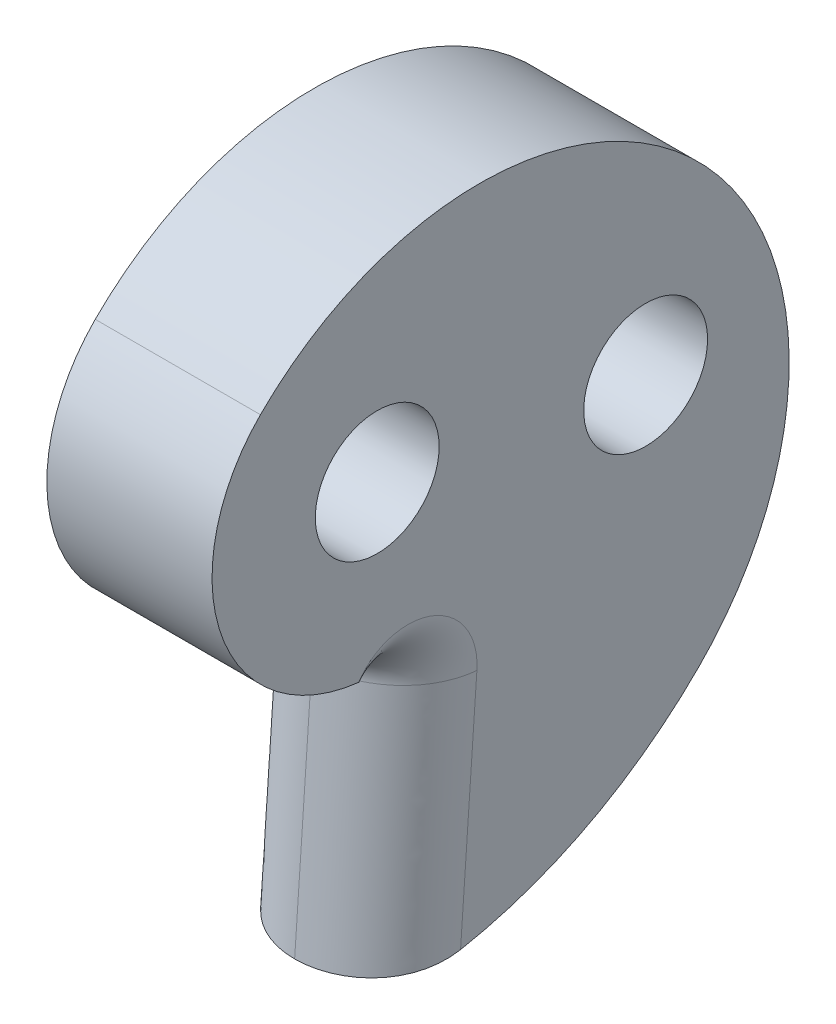
ISO-10303-21;
HEADER;
FILE_DESCRIPTION(('STEP AP214'),'2;1');
FILE_NAME('part.step','',(''),(''),'','','');
FILE_SCHEMA(('AUTOMOTIVE_DESIGN { 1 0 10303 214 1 1 1 1 }'));
ENDSEC;
DATA;
#1=APPLICATION_CONTEXT('core data for automotive mechanical design processes');
#2=APPLICATION_PROTOCOL_DEFINITION('international standard','automotive_design',2000,#1);
#3=PRODUCT_CONTEXT('',#1,'mechanical');
#4=PRODUCT('Part','Part','',(#3));
#5=PRODUCT_RELATED_PRODUCT_CATEGORY('part','',(#4));
#6=PRODUCT_DEFINITION_FORMATION('','',#4);
#7=PRODUCT_DEFINITION_CONTEXT('part definition',#1,'design');
#8=PRODUCT_DEFINITION('design','',#6,#7);
#9=PRODUCT_DEFINITION_SHAPE('','',#8);
#10=(LENGTH_UNIT() NAMED_UNIT(*) SI_UNIT(.MILLI.,.METRE.));
#11=(NAMED_UNIT(*) PLANE_ANGLE_UNIT() SI_UNIT($,.RADIAN.));
#12=(NAMED_UNIT(*) SI_UNIT($,.STERADIAN.) SOLID_ANGLE_UNIT());
#13=UNCERTAINTY_MEASURE_WITH_UNIT(LENGTH_MEASURE(1.E-05),#10,'distance_accuracy_value','');
#14=(GEOMETRIC_REPRESENTATION_CONTEXT(3) GLOBAL_UNCERTAINTY_ASSIGNED_CONTEXT((#13)) GLOBAL_UNIT_ASSIGNED_CONTEXT((#10,
#11,#12)) REPRESENTATION_CONTEXT('',''));
#15=CARTESIAN_POINT('',(0.,0.,0.));
#16=DIRECTION('',(0.,0.,1.));
#17=DIRECTION('',(1.,0.,0.));
#18=AXIS2_PLACEMENT_3D('',#15,#16,#17);
#19=CARTESIAN_POINT('',(2.,0.,0.));
#20=DIRECTION('',(1.,0.,0.));
#21=DIRECTION('',(0.,0.,-1.));
#22=AXIS2_PLACEMENT_3D('',#19,#20,#21);
#23=PLANE('',#22);
#24=CARTESIAN_POINT('',(2.,-1.,-6.5));
#25=DIRECTION('',(1.,0.,0.));
#26=DIRECTION('',(0.,0.,-1.));
#27=AXIS2_PLACEMENT_3D('',#24,#25,#26);
#28=CIRCLE('',#27,1.5);
#29=CARTESIAN_POINT('',(2.,-1.,-8.));
#30=VERTEX_POINT('',#29);
#31=EDGE_CURVE('E392',#30,#30,#28,.T.);
#32=ORIENTED_EDGE('',*,*,#31,.F.);
#33=EDGE_LOOP('',(#32));
#34=FACE_BOUND('',#33,.T.);
#35=CARTESIAN_POINT('',(2.,0.,0.));
#36=DIRECTION('',(1.,0.,0.));
#37=DIRECTION('',(0.,0.,-1.));
#38=AXIS2_PLACEMENT_3D('',#35,#36,#37);
#39=CIRCLE('',#38,4.);
#40=CARTESIAN_POINT('',(2.,2.82842712474619,2.82842712474619));
#41=VERTEX_POINT('',#40);
#42=CARTESIAN_POINT('',(2.,-3.97490224209066,0.447383689714602));
#43=VERTEX_POINT('',#42);
#44=EDGE_CURVE('E120',#41,#43,#39,.T.);
#45=ORIENTED_EDGE('',*,*,#44,.T.);
#46=CARTESIAN_POINT('',(2.,-5.1541286459293,-2.4136669429844));
#47=CARTESIAN_POINT('',(2.,-4.96488405236713,-2.4269001763552));
#48=CARTESIAN_POINT('',(2.,-4.77355355781794,-2.40614008160652));
#49=CARTESIAN_POINT('',(2.,-4.40982040935075,-2.30279187230695));
#50=CARTESIAN_POINT('',(2.,-4.23754571878671,-2.22026107572609));
#51=CARTESIAN_POINT('',(2.,-3.93105009129211,-2.00636272966285));
#52=CARTESIAN_POINT('',(2.,-3.79686967177225,-1.87507035440615));
#53=CARTESIAN_POINT('',(2.,-3.57931016434995,-1.58134171138624));
#54=CARTESIAN_POINT('',(2.,-3.49594596821804,-1.41898645847501));
#55=CARTESIAN_POINT('',(2.,-3.3856678515179,-1.08312983414982));
#56=CARTESIAN_POINT('',(2.,-3.35874326159117,-0.909707579794832));
#57=CARTESIAN_POINT('',(2.,-3.35982887755761,-0.571570723172949));
#58=CARTESIAN_POINT('',(2.,-3.38780505516719,-0.406926058457946));
#59=CARTESIAN_POINT('',(2.,-3.49069457441738,-0.103773839901499));
#60=CARTESIAN_POINT('',(2.,-3.56555464269793,0.0346792306066891));
#61=CARTESIAN_POINT('',(2.,-3.74906615538121,0.27234744851333));
#62=CARTESIAN_POINT('',(2.,-3.85766978631427,0.371540782470094));
#63=CARTESIAN_POINT('',(2.,-3.97490224209066,0.447383689714602));
#64=(BOUNDED_CURVE() B_SPLINE_CURVE(3,(#46,#47,#48,#49,#50,#51,#52,#53,#54,#55,#56,#57,#58,#59,
#60,#61,#62,#63),.UNSPECIFIED.,.F.,.F.) B_SPLINE_CURVE_WITH_KNOTS((4,2,2,2,2,2,2,2,4),
(4.82446941498235,5.01553554776698,5.2066016805516,5.39766781333623,5.58873394612086,
5.77980007890548,5.97086621169011,6.16193234447474,6.35299847725936),
.UNSPECIFIED.) CURVE() GEOMETRIC_REPRESENTATION_ITEM() RATIONAL_B_SPLINE_CURVE((1.,1.,1.,1.,1.,
1.,1.,1.,1.,1.,1.,1.,1.,1.,1.,1.,1.,1.)) REPRESENTATION_ITEM(''));
#65=CARTESIAN_POINT('',(2.,-5.1541286459293,-2.4136669429844));
#66=VERTEX_POINT('',#65);
#67=EDGE_CURVE('E129',#43,#66,#64,.F.);
#68=ORIENTED_EDGE('',*,*,#67,.T.);
#69=CARTESIAN_POINT('',(2.,-5.1541286459293,-2.4136669429844));
#70=CARTESIAN_POINT('',(2.,-7.14925674644895,-2.27415399549615));
#71=CARTESIAN_POINT('',(2.,-9.1443848469686,-2.1346410480079));
#72=CARTESIAN_POINT('',(2.,-11.1395129474883,-1.99512810051965));
#73=CARTESIAN_POINT('',(2.,-15.1297691485275,-1.71610220554315));
#74=CARTESIAN_POINT('',(2.,-19.1200253495668,-1.43707631056664));
#75=CARTESIAN_POINT('',(2.,-23.1102815506061,-1.15805041559014));
#76=(BOUNDED_CURVE() B_SPLINE_CURVE(3,(#69,#70,#71,#72,#73,#74,#75),.UNSPECIFIED.,.F.,
.F.) B_SPLINE_CURVE_WITH_KNOTS((4,3,4),(-0.006,0.,0.012),
.UNSPECIFIED.) CURVE() GEOMETRIC_REPRESENTATION_ITEM() RATIONAL_B_SPLINE_CURVE((1.,1.,1.,1.,1.,
1.,1.)) REPRESENTATION_ITEM(''));
#77=CARTESIAN_POINT('',(2.,-10.8133217747798,-2.01793760931126));
#78=VERTEX_POINT('',#77);
#79=EDGE_CURVE('E107',#66,#78,#76,.T.);
#80=ORIENTED_EDGE('',*,*,#79,.T.);
#81=CARTESIAN_POINT('',(2.,0.,0.));
#82=DIRECTION('',(1.,0.,0.));
#83=DIRECTION('',(0.,0.,-1.));
#84=AXIS2_PLACEMENT_3D('',#81,#82,#83);
#85=CIRCLE('',#84,11.);
#86=CARTESIAN_POINT('',(2.,-7.77817459305204,-7.77817459305201));
#87=VERTEX_POINT('',#86);
#88=EDGE_CURVE('E99',#78,#87,#85,.T.);
#89=ORIENTED_EDGE('',*,*,#88,.T.);
#90=CARTESIAN_POINT('',(2.,-2.47487373415292,-2.47487373415291));
#91=DIRECTION('',(1.,0.,0.));
#92=DIRECTION('',(0.,0.,1.));
#93=AXIS2_PLACEMENT_3D('',#90,#91,#92);
#94=CIRCLE('',#93,7.5);
#95=EDGE_CURVE('E103',#87,#41,#94,.T.);
#96=ORIENTED_EDGE('',*,*,#95,.T.);
#97=EDGE_LOOP('',(#45,#68,#80,#89,#96));
#98=FACE_BOUND('',#97,.T.);
#99=CARTESIAN_POINT('',(2.,0.,0.));
#100=DIRECTION('',(1.,0.,0.));
#101=DIRECTION('',(0.,0.,-1.));
#102=AXIS2_PLACEMENT_3D('',#99,#100,#101);
#103=CIRCLE('',#102,1.5);
#104=CARTESIAN_POINT('',(2.,0.,-1.5));
#105=VERTEX_POINT('',#104);
#106=EDGE_CURVE('E380',#105,#105,#103,.T.);
#107=ORIENTED_EDGE('',*,*,#106,.F.);
#108=EDGE_LOOP('',(#107));
#109=FACE_BOUND('',#108,.T.);
#110=ADVANCED_FACE('F41',(#34,#98,#109),#23,.T.);
#111=CARTESIAN_POINT('',(-2.,0.,0.));
#112=DIRECTION('',(1.,0.,0.));
#113=DIRECTION('',(0.,0.,-1.));
#114=AXIS2_PLACEMENT_3D('',#111,#112,#113);
#115=PLANE('',#114);
#116=CARTESIAN_POINT('',(-2.,-1.,-6.5));
#117=DIRECTION('',(1.,0.,0.));
#118=DIRECTION('',(0.,0.,-1.));
#119=AXIS2_PLACEMENT_3D('',#116,#117,#118);
#120=CIRCLE('',#119,1.5);
#121=CARTESIAN_POINT('',(-2.,-1.,-8.));
#122=VERTEX_POINT('',#121);
#123=EDGE_CURVE('E49',#122,#122,#120,.T.);
#124=ORIENTED_EDGE('',*,*,#123,.T.);
#125=EDGE_LOOP('',(#124));
#126=FACE_BOUND('',#125,.T.);
#127=CARTESIAN_POINT('',(-2.,-5.1541286459293,-2.4136669429844));
#128=CARTESIAN_POINT('',(-2.,-7.14925674644895,-2.27415399549615));
#129=CARTESIAN_POINT('',(-2.,-9.1443848469686,-2.1346410480079));
#130=CARTESIAN_POINT('',(-2.,-11.1395129474883,-1.99512810051965));
#131=CARTESIAN_POINT('',(-2.,-15.1297691485275,-1.71610220554315));
#132=CARTESIAN_POINT('',(-2.,-19.1200253495668,-1.43707631056664));
#133=CARTESIAN_POINT('',(-2.,-23.1102815506061,-1.15805041559014));
#134=(BOUNDED_CURVE() B_SPLINE_CURVE(3,(#127,#128,#129,#130,#131,#132,#133),.UNSPECIFIED.,.F.,
.F.) B_SPLINE_CURVE_WITH_KNOTS((4,3,4),(-0.006,0.,0.012),
.UNSPECIFIED.) CURVE() GEOMETRIC_REPRESENTATION_ITEM() RATIONAL_B_SPLINE_CURVE((1.,1.,1.,1.,1.,
1.,1.)) REPRESENTATION_ITEM(''));
#135=CARTESIAN_POINT('',(-2.,-10.8133217747798,-2.01793760931126));
#136=VERTEX_POINT('',#135);
#137=CARTESIAN_POINT('',(-2.,-5.1541286459293,-2.4136669429844));
#138=VERTEX_POINT('',#137);
#139=EDGE_CURVE('E69',#136,#138,#134,.F.);
#140=ORIENTED_EDGE('',*,*,#139,.T.);
#141=CARTESIAN_POINT('',(-2.,-3.97490224209066,0.447383689714602));
#142=CARTESIAN_POINT('',(-2.,-3.85766978631427,0.371540782470094));
#143=CARTESIAN_POINT('',(-2.,-3.74906615538121,0.27234744851333));
#144=CARTESIAN_POINT('',(-2.,-3.56555464269793,0.0346792306066891));
#145=CARTESIAN_POINT('',(-2.,-3.49069457441738,-0.103773839901499));
#146=CARTESIAN_POINT('',(-2.,-3.38780505516719,-0.406926058457946));
#147=CARTESIAN_POINT('',(-2.,-3.35982887755761,-0.571570723172949));
#148=CARTESIAN_POINT('',(-2.,-3.35874326159117,-0.909707579794832));
#149=CARTESIAN_POINT('',(-2.,-3.3856678515179,-1.08312983414982));
#150=CARTESIAN_POINT('',(-2.,-3.49594596821804,-1.41898645847501));
#151=CARTESIAN_POINT('',(-2.,-3.57931016434995,-1.58134171138624));
#152=CARTESIAN_POINT('',(-2.,-3.79686967177225,-1.87507035440615));
#153=CARTESIAN_POINT('',(-2.,-3.93105009129211,-2.00636272966285));
#154=CARTESIAN_POINT('',(-2.,-4.23754571878671,-2.22026107572609));
#155=CARTESIAN_POINT('',(-2.,-4.40982040935075,-2.30279187230695));
#156=CARTESIAN_POINT('',(-2.,-4.77355355781794,-2.40614008160652));
#157=CARTESIAN_POINT('',(-2.,-4.96488405236713,-2.4269001763552));
#158=CARTESIAN_POINT('',(-2.,-5.1541286459293,-2.4136669429844));
#159=(BOUNDED_CURVE() B_SPLINE_CURVE(3,(#141,#142,#143,#144,#145,#146,#147,#148,#149,#150,#151,
#152,#153,#154,#155,#156,#157,#158),.UNSPECIFIED.,.F.,.F.) B_SPLINE_CURVE_WITH_KNOTS((4,2,2,2,2,
2,2,2,4),(4.82446941498235,5.01553554776698,5.2066016805516,5.39766781333623,5.58873394612086,
5.77980007890548,5.97086621169011,6.16193234447474,6.35299847725936),
.UNSPECIFIED.) CURVE() GEOMETRIC_REPRESENTATION_ITEM() RATIONAL_B_SPLINE_CURVE((1.,1.,1.,1.,1.,
1.,1.,1.,1.,1.,1.,1.,1.,1.,1.,1.,1.,1.)) REPRESENTATION_ITEM(''));
#160=CARTESIAN_POINT('',(-2.,-3.97490224209066,0.447383689714602));
#161=VERTEX_POINT('',#160);
#162=EDGE_CURVE('E175',#138,#161,#159,.F.);
#163=ORIENTED_EDGE('',*,*,#162,.T.);
#164=CARTESIAN_POINT('',(-2.,0.,0.));
#165=DIRECTION('',(1.,0.,0.));
#166=DIRECTION('',(0.,0.,-1.));
#167=AXIS2_PLACEMENT_3D('',#164,#165,#166);
#168=CIRCLE('',#167,4.);
#169=CARTESIAN_POINT('',(-2.,2.82842712474619,2.82842712474619));
#170=VERTEX_POINT('',#169);
#171=EDGE_CURVE('E110',#170,#161,#168,.T.);
#172=ORIENTED_EDGE('',*,*,#171,.F.);
#173=CARTESIAN_POINT('',(-2.,-2.47487373415292,-2.47487373415291));
#174=DIRECTION('',(1.,0.,0.));
#175=DIRECTION('',(0.,0.,1.));
#176=AXIS2_PLACEMENT_3D('',#173,#174,#175);
#177=CIRCLE('',#176,7.5);
#178=CARTESIAN_POINT('',(-2.,-7.77817459305204,-7.77817459305201));
#179=VERTEX_POINT('',#178);
#180=EDGE_CURVE('E342',#179,#170,#177,.T.);
#181=ORIENTED_EDGE('',*,*,#180,.F.);
#182=CARTESIAN_POINT('',(-2.,0.,0.));
#183=DIRECTION('',(1.,0.,0.));
#184=DIRECTION('',(0.,0.,-1.));
#185=AXIS2_PLACEMENT_3D('',#182,#183,#184);
#186=CIRCLE('',#185,11.);
#187=EDGE_CURVE('E123',#136,#179,#186,.T.);
#188=ORIENTED_EDGE('',*,*,#187,.F.);
#189=EDGE_LOOP('',(#140,#163,#172,#181,#188));
#190=FACE_BOUND('',#189,.T.);
#191=CARTESIAN_POINT('',(-2.,0.,0.));
#192=DIRECTION('',(1.,0.,0.));
#193=DIRECTION('',(0.,0.,-1.));
#194=AXIS2_PLACEMENT_3D('',#191,#192,#193);
#195=CIRCLE('',#194,1.5);
#196=CARTESIAN_POINT('',(-2.,0.,-1.5));
#197=VERTEX_POINT('',#196);
#198=EDGE_CURVE('E384',#197,#197,#195,.T.);
#199=ORIENTED_EDGE('',*,*,#198,.T.);
#200=EDGE_LOOP('',(#199));
#201=FACE_BOUND('',#200,.T.);
#202=ADVANCED_FACE('F151',(#126,#190,#201),#115,.F.);
#203=CARTESIAN_POINT('',(2.,0.,0.));
#204=DIRECTION('',(-1.,0.,0.));
#205=DIRECTION('',(0.,0.,1.));
#206=AXIS2_PLACEMENT_3D('',#203,#204,#205);
#207=CYLINDRICAL_SURFACE('',#206,11.);
#208=ORIENTED_EDGE('',*,*,#88,.F.);
#209=CARTESIAN_POINT('',(2.,-10.8133217747798,-2.01793760931127));
#210=CARTESIAN_POINT('',(2.00000517733441,-10.8238189049645,-1.96171022468114));
#211=CARTESIAN_POINT('',(1.99770147188637,-10.8338698034792,-1.90539738289484));
#212=CARTESIAN_POINT('',(1.98845789576588,-10.8530377519927,-1.79298613884788));
#213=CARTESIAN_POINT('',(1.98151737424828,-10.8621546706865,-1.73688776780323));
#214=CARTESIAN_POINT('',(1.96298080372934,-10.8794111883006,-1.6253011025818));
#215=CARTESIAN_POINT('',(1.9513842770395,-10.8875506868298,-1.56981287160338));
#216=CARTESIAN_POINT('',(1.92357793361245,-10.9028355260168,-1.45988491763107));
#217=CARTESIAN_POINT('',(1.90736842921144,-10.9099809339338,-1.40544512391578));
#218=CARTESIAN_POINT('',(1.85184121471693,-10.9299485662623,-1.24415185682491));
#219=CARTESIAN_POINT('',(1.80563502743663,-10.9412927497307,-1.13938644949315));
#220=CARTESIAN_POINT('',(1.6960249744411,-10.960307483588,-0.939052189143064));
#221=CARTESIAN_POINT('',(1.63263129383317,-10.9679802022222,-0.843477934850468));
#222=CARTESIAN_POINT('',(1.49177900110132,-10.9801600352457,-0.666205136937389));
#223=CARTESIAN_POINT('',(1.41462675969385,-10.9847273434823,-0.58426748166376));
#224=CARTESIAN_POINT('',(1.24757936436636,-10.991673848062,-0.43445263631939));
#225=CARTESIAN_POINT('',(1.157680718931,-10.9940524435278,-0.366579311353192));
#226=CARTESIAN_POINT('',(0.968269680935552,-10.9973825866432,-0.247249068012772));
#227=CARTESIAN_POINT('',(0.868813472824572,-10.9983419889351,-0.19570304209769));
#228=CARTESIAN_POINT('',(0.662698547315241,-10.9995340273872,-0.109994124844588));
#229=CARTESIAN_POINT('',(0.556043926582558,-10.9997670734174,-0.0758214391507378));
#230=CARTESIAN_POINT('',(0.374001107771422,-10.9999606892983,-0.0339223386239985));
#231=CARTESIAN_POINT('',(0.299721226677161,-10.9999852127505,-0.0212098745983516));
#232=CARTESIAN_POINT('',(0.150304261485127,-11.0000000595428,-0.00424915842964917));
#233=CARTESIAN_POINT('',(0.0751684854105783,-10.9999904295056,1.06200260928916E-05));
#234=CARTESIAN_POINT('',(0.,-11.,0.));
#235=B_SPLINE_CURVE_WITH_KNOTS('',3,(#209,#210,#211,#212,#213,#214,#215,#216,#217,#218,#219,
#220,#221,#222,#223,#224,#225,#226,#227,#228,#229,#230,#231,#232,#233,#234),.UNSPECIFIED.,.F.,
.F.,(4,2,2,2,2,2,2,2,2,2,2,2,4),(0.,0.171550614277184,0.34312531326023,0.514717619657142,
0.686298310618444,1.02964774485682,1.37279415727711,1.70908354094548,2.0454652201434,
2.37997810927672,2.71430220446127,2.93993136418206,3.16525263780726),.UNSPECIFIED.);
#236=CARTESIAN_POINT('',(0.,-11.,0.));
#237=VERTEX_POINT('',#236);
#238=EDGE_CURVE('E11',#78,#237,#235,.T.);
#239=ORIENTED_EDGE('',*,*,#238,.T.);
#240=CARTESIAN_POINT('',(0.,-11.,0.));
#241=CARTESIAN_POINT('',(-0.056074248165987,-10.9999975478475,4.50914547810893E-07));
#242=CARTESIAN_POINT('',(-0.112123717129901,-11.0000002839592,-0.00236512017619028));
#243=CARTESIAN_POINT('',(-0.223819842704682,-10.9999951545105,-0.0118019326792144));
#244=CARTESIAN_POINT('',(-0.279466536042164,-10.9999872899292,-0.018872739443767));
#245=CARTESIAN_POINT('',(-0.445119059680714,-10.9999164097138,-0.0470753146214452));
#246=CARTESIAN_POINT('',(-0.554011081671133,-10.9998062283479,-0.0751974185383638));
#247=CARTESIAN_POINT('',(-0.765576915921702,-10.9990476766692,-0.149361811638124));
#248=CARTESIAN_POINT('',(-0.86824740177818,-10.9983990211331,-0.195413591085009));
#249=CARTESIAN_POINT('',(-1.01524180083841,-10.9965488090851,-0.276842762611986));
#250=CARTESIAN_POINT('',(-1.06307629535231,-10.9957857336411,-0.306048328047436));
#251=CARTESIAN_POINT('',(-1.15615896103958,-10.9938735055288,-0.368404450866352));
#252=CARTESIAN_POINT('',(-1.20140462578611,-10.9927239858781,-0.401558738712329));
#253=CARTESIAN_POINT('',(-1.33245570949533,-10.9885603261644,-0.506377410338723));
#254=CARTESIAN_POINT('',(-1.41390481580853,-10.9848282510801,-0.583580748466253));
#255=CARTESIAN_POINT('',(-1.56267656061979,-10.9746899004513,-0.750421707829987));
#256=CARTESIAN_POINT('',(-1.6299993763313,-10.9682836584571,-0.84005917305739));
#257=CARTESIAN_POINT('',(-1.71896189973369,-10.9562175431465,-0.981606488797583));
#258=CARTESIAN_POINT('',(-1.74660183987044,-10.9517888203478,-1.02994532776593));
#259=CARTESIAN_POINT('',(-1.79774444218358,-10.9420576965216,-1.12863863084168));
#260=CARTESIAN_POINT('',(-1.82125081601845,-10.9367560876557,-1.17899123633208));
#261=CARTESIAN_POINT('',(-1.86401749540221,-10.9252330483115,-1.28138089378434));
#262=CARTESIAN_POINT('',(-1.8832765594513,-10.9190113497739,-1.33341843317286));
#263=CARTESIAN_POINT('',(-1.91745003384391,-10.9056287358159,-1.43878017712802));
#264=CARTESIAN_POINT('',(-1.93236427945321,-10.8984677847986,-1.49210443039757));
#265=CARTESIAN_POINT('',(-1.96341369995399,-10.8798161232118,-1.62348648017443));
#266=CARTESIAN_POINT('',(-1.9771672116799,-10.8678119249352,-1.70204460611901));
#267=CARTESIAN_POINT('',(-1.99546686994146,-10.8419413104194,-1.85978274911446));
#268=CARTESIAN_POINT('',(-2.00002894710735,-10.8280781606926,-1.93896145097489));
#269=CARTESIAN_POINT('',(-2.,-10.8133217747798,-2.01793760931127));
#270=B_SPLINE_CURVE_WITH_KNOTS('',3,(#240,#241,#242,#243,#244,#245,#246,#247,#248,#249,#250,
#251,#252,#253,#254,#255,#256,#257,#258,#259,#260,#261,#262,#263,#264,#265,#266,#267,#268,#269),
.UNSPECIFIED.,.F.,.F.,(4,2,2,2,2,2,2,2,2,2,2,2,2,2,4),(0.,0.168123659184893,0.336231790045522,
0.671933491435963,1.00781312346017,1.1757902051173,1.34392725707118,1.67908477047335,
2.01423807909359,2.18165053892336,2.34891189762095,2.51622208264219,2.68353861042039,
2.92491535290544,3.165873379137),.UNSPECIFIED.);
#271=EDGE_CURVE('E55',#237,#136,#270,.T.);
#272=ORIENTED_EDGE('',*,*,#271,.T.);
#273=ORIENTED_EDGE('',*,*,#187,.T.);
#274=DIRECTION('',(-1.,0.,0.));
#275=VECTOR('',#274,1.);
#276=CARTESIAN_POINT('',(2.,-7.77817459305204,-7.77817459305201));
#277=LINE('',#276,#275);
#278=EDGE_CURVE('E115',#87,#179,#277,.T.);
#279=ORIENTED_EDGE('',*,*,#278,.F.);
#280=EDGE_LOOP('',(#208,#239,#272,#273,#279));
#281=FACE_BOUND('',#280,.T.);
#282=ADVANCED_FACE('F122',(#281),#207,.T.);
#283=CARTESIAN_POINT('',(2.,-2.47487373415292,-2.47487373415291));
#284=DIRECTION('',(-1.,0.,0.));
#285=DIRECTION('',(0.,0.,1.));
#286=AXIS2_PLACEMENT_3D('',#283,#284,#285);
#287=CYLINDRICAL_SURFACE('',#286,7.5);
#288=ORIENTED_EDGE('',*,*,#180,.T.);
#289=DIRECTION('',(-1.,0.,0.));
#290=VECTOR('',#289,1.);
#291=CARTESIAN_POINT('',(2.,2.82842712474619,2.82842712474619));
#292=LINE('',#291,#290);
#293=EDGE_CURVE('E117',#41,#170,#292,.T.);
#294=ORIENTED_EDGE('',*,*,#293,.F.);
#295=ORIENTED_EDGE('',*,*,#95,.F.);
#296=ORIENTED_EDGE('',*,*,#278,.T.);
#297=EDGE_LOOP('',(#288,#294,#295,#296));
#298=FACE_BOUND('',#297,.T.);
#299=ADVANCED_FACE('F114',(#298),#287,.T.);
#300=CARTESIAN_POINT('',(2.,0.,0.));
#301=DIRECTION('',(-1.,0.,0.));
#302=DIRECTION('',(0.,0.,1.));
#303=AXIS2_PLACEMENT_3D('',#300,#301,#302);
#304=CYLINDRICAL_SURFACE('',#303,4.);
#305=ORIENTED_EDGE('',*,*,#171,.T.);
#306=DIRECTION('',(-1.,0.,0.));
#307=VECTOR('',#306,1.);
#308=CARTESIAN_POINT('',(2.,-3.97490224209066,0.447383689714602));
#309=LINE('',#308,#307);
#310=EDGE_CURVE('E131',#43,#161,#309,.T.);
#311=ORIENTED_EDGE('',*,*,#310,.F.);
#312=ORIENTED_EDGE('',*,*,#44,.F.);
#313=ORIENTED_EDGE('',*,*,#293,.T.);
#314=EDGE_LOOP('',(#305,#311,#312,#313));
#315=FACE_BOUND('',#314,.T.);
#316=ADVANCED_FACE('F340',(#315),#304,.T.);
#317=CARTESIAN_POINT('',(2.,-4.9464182657789,0.556729881601297));
#318=DIRECTION('',(-1.,0.,0.));
#319=DIRECTION('',(0.,0.,1.));
#320=AXIS2_PLACEMENT_3D('',#317,#318,#319);
#321=CYLINDRICAL_SURFACE('',#320,0.977650230891974);
#322=CARTESIAN_POINT('',(0.,-5.01461569844105,-0.418538842464753));
#323=CARTESIAN_POINT('',(-3.73171686899396E-08,-4.95250146673682,-0.42288229266415));
#324=CARTESIAN_POINT('',(-0.0156250186584184,-4.8899736525645,-0.421273668346372));
#325=CARTESIAN_POINT('',(-0.0742187313415814,-4.76635742887524,-0.406210943727404));
#326=CARTESIAN_POINT('',(-0.117187518658385,-4.70527233074388,-0.392757125201457));
#327=CARTESIAN_POINT('',(-0.226562481341612,-4.58676613227748,-0.354493077360472));
#328=CARTESIAN_POINT('',(-0.292968768658415,-4.52934759798842,-0.329683676586961));
#329=CARTESIAN_POINT('',(-0.445312481341583,-4.42026449850846,-0.269610938677049));
#330=CARTESIAN_POINT('',(-0.531250018658395,-4.36860229532275,-0.234348902311523));
#331=CARTESIAN_POINT('',(-0.7187499813416,-4.27291241167142,-0.154653842245485));
#332=CARTESIAN_POINT('',(-0.820312518658398,-4.22888680320407,-0.110222544203118));
#333=CARTESIAN_POINT('',(-1.0351562313416,-4.15007280153689,-0.0138056910428145));
#334=CARTESIAN_POINT('',(-1.14843751865839,-4.11528611491739,0.0381777763356024));
#335=CARTESIAN_POINT('',(-1.3828124813416,-4.05621645787338,0.147807298129915));
#336=CARTESIAN_POINT('',(-1.5039062686584,-4.03193476649977,0.205450978708799));
#337=CARTESIAN_POINT('',(-1.7499999813416,-3.99475931451937,0.324303165067295));
#338=CARTESIAN_POINT('',(-1.87499976288727,-3.98186637365677,0.385508966042799));
#339=CARTESIAN_POINT('',(-2.,-3.97490224209066,0.447383689714602));
#340=(BOUNDED_CURVE() B_SPLINE_CURVE(3,(#322,#323,#324,#325,#326,#327,#328,#329,#330,#331,#332,
#333,#334,#335,#336,#337,#338,#339),.UNSPECIFIED.,.F.,.F.) B_SPLINE_CURVE_WITH_KNOTS((4,2,2,2,2,
2,2,2,4),(4.82446941498235,5.01553554776698,5.2066016805516,5.39766781333623,5.58873394612086,
5.77980007890548,5.97086621169011,6.16193234447474,6.35299847725936),
.UNSPECIFIED.) CURVE() GEOMETRIC_REPRESENTATION_ITEM() RATIONAL_B_SPLINE_CURVE((1.,1.,1.,1.,1.,
1.,1.,1.,1.,1.,1.,1.,1.,1.,1.,1.,1.,1.)) REPRESENTATION_ITEM(''));
#341=CARTESIAN_POINT('',(0.,-5.01461569844106,-0.418538842464753));
#342=VERTEX_POINT('',#341);
#343=EDGE_CURVE('E303',#161,#342,#340,.F.);
#344=ORIENTED_EDGE('',*,*,#343,.T.);
#345=CARTESIAN_POINT('',(2.,-3.97490224209066,0.447383689714602));
#346=CARTESIAN_POINT('',(1.87499976288728,-3.98186637365678,0.385508966042772));
#347=CARTESIAN_POINT('',(1.7499999813416,-3.99475931451937,0.324303165067295));
#348=CARTESIAN_POINT('',(1.5039062686584,-4.03193476649977,0.205450978708799));
#349=CARTESIAN_POINT('',(1.3828124813416,-4.05621645787338,0.147807298129915));
#350=CARTESIAN_POINT('',(1.14843751865839,-4.11528611491739,0.0381777763356024));
#351=CARTESIAN_POINT('',(1.0351562313416,-4.15007280153689,-0.0138056910428145));
#352=CARTESIAN_POINT('',(0.820312518658399,-4.22888680320407,-0.110222544203118));
#353=CARTESIAN_POINT('',(0.7187499813416,-4.27291241167142,-0.154653842245485));
#354=CARTESIAN_POINT('',(0.531250018658395,-4.36860229532275,-0.234348902311523));
#355=CARTESIAN_POINT('',(0.445312481341583,-4.42026449850846,-0.269610938677049));
#356=CARTESIAN_POINT('',(0.292968768658415,-4.52934759798842,-0.329683676586961));
#357=CARTESIAN_POINT('',(0.226562481341619,-4.58676613227748,-0.354493077360472));
#358=CARTESIAN_POINT('',(0.117187518658379,-4.70527233074388,-0.392757125201457));
#359=CARTESIAN_POINT('',(0.0742187313415814,-4.76635742887524,-0.406210943727404));
#360=CARTESIAN_POINT('',(0.0156250186584184,-4.8899736525645,-0.421273668346372));
#361=CARTESIAN_POINT('',(3.73171686899396E-08,-4.95250146673682,-0.42288229266415));
#362=CARTESIAN_POINT('',(0.,-5.01461569844105,-0.418538842464753));
#363=(BOUNDED_CURVE() B_SPLINE_CURVE(3,(#345,#346,#347,#348,#349,#350,#351,#352,#353,#354,#355,
#356,#357,#358,#359,#360,#361,#362),.UNSPECIFIED.,.F.,.F.) B_SPLINE_CURVE_WITH_KNOTS((4,2,2,2,2,
2,2,2,4),(4.82446941498235,5.01553554776698,5.2066016805516,5.39766781333623,5.58873394612086,
5.77980007890548,5.97086621169011,6.16193234447474,6.35299847725936),
.UNSPECIFIED.) CURVE() GEOMETRIC_REPRESENTATION_ITEM() RATIONAL_B_SPLINE_CURVE((1.,1.,1.,1.,1.,
1.,1.,1.,1.,1.,1.,1.,1.,1.,1.,1.,1.,1.)) REPRESENTATION_ITEM(''));
#364=EDGE_CURVE('E176',#342,#43,#363,.F.);
#365=ORIENTED_EDGE('',*,*,#364,.T.);
#366=ORIENTED_EDGE('',*,*,#310,.T.);
#367=EDGE_LOOP('',(#344,#365,#366));
#368=FACE_BOUND('',#367,.T.);
#369=ADVANCED_FACE('F159',(#368),#321,.F.);
#370=CARTESIAN_POINT('',(2.,0.,0.));
#371=DIRECTION('',(-1.,0.,0.));
#372=DIRECTION('',(0.,0.,1.));
#373=AXIS2_PLACEMENT_3D('',#370,#371,#372);
#374=CYLINDRICAL_SURFACE('',#373,1.5);
#375=ORIENTED_EDGE('',*,*,#106,.T.);
#376=EDGE_LOOP('',(#375));
#377=FACE_BOUND('',#376,.T.);
#378=ORIENTED_EDGE('',*,*,#198,.F.);
#379=EDGE_LOOP('',(#378));
#380=FACE_BOUND('',#379,.T.);
#381=ADVANCED_FACE('F153',(#377,#380),#374,.F.);
#382=CARTESIAN_POINT('',(-2.,-3.97490224209066,0.447383689714602));
#383=CARTESIAN_POINT('',(-1.87499976288727,-3.98186637365677,0.385508966042799));
#384=CARTESIAN_POINT('',(-1.7499999813416,-3.99475931451937,0.324303165067295));
#385=CARTESIAN_POINT('',(-1.5039062686584,-4.03193476649977,0.205450978708799));
#386=CARTESIAN_POINT('',(-1.3828124813416,-4.05621645787338,0.147807298129915));
#387=CARTESIAN_POINT('',(-1.14843751865839,-4.11528611491739,0.0381777763356024));
#388=CARTESIAN_POINT('',(-1.0351562313416,-4.15007280153689,-0.0138056910428145));
#389=CARTESIAN_POINT('',(-0.820312518658398,-4.22888680320407,-0.110222544203118));
#390=CARTESIAN_POINT('',(-0.7187499813416,-4.27291241167142,-0.154653842245485));
#391=CARTESIAN_POINT('',(-0.531250018658395,-4.36860229532275,-0.234348902311523));
#392=CARTESIAN_POINT('',(-0.445312481341583,-4.42026449850846,-0.269610938677049));
#393=CARTESIAN_POINT('',(-0.292968768658415,-4.52934759798842,-0.329683676586961));
#394=CARTESIAN_POINT('',(-0.226562481341612,-4.58676613227748,-0.354493077360472));
#395=CARTESIAN_POINT('',(-0.117187518658385,-4.70527233074388,-0.392757125201457));
#396=CARTESIAN_POINT('',(-0.0742187313415814,-4.76635742887524,-0.406210943727404));
#397=CARTESIAN_POINT('',(-0.0156250186584184,-4.8899736525645,-0.421273668346372));
#398=CARTESIAN_POINT('',(-3.73171686899396E-08,-4.95250146673682,-0.42288229266415));
#399=CARTESIAN_POINT('',(0.,-5.01461569844105,-0.418538842464753));
#400=CARTESIAN_POINT('',(-2.,-3.97490224209066,0.447383689714602));
#401=CARTESIAN_POINT('',(-2.,-3.98186643006001,0.385508465062295));
#402=CARTESIAN_POINT('',(-1.99999999999999,-3.99475931451935,0.324303165067287));
#403=CARTESIAN_POINT('',(-2.00000000000001,-4.03193476649979,0.205450978708807));
#404=CARTESIAN_POINT('',(-2.00000000000001,-4.05621645787338,0.147807298129916));
#405=CARTESIAN_POINT('',(-1.99999999999999,-4.11528611491739,0.0381777763356007));
#406=CARTESIAN_POINT('',(-2.,-4.15007280153689,-0.0138056910428196));
#407=CARTESIAN_POINT('',(-2.,-4.22888680320407,-0.110222544203113));
#408=CARTESIAN_POINT('',(-2.,-4.27291241167142,-0.154653842245486));
#409=CARTESIAN_POINT('',(-2.,-4.36860229532275,-0.234348902311523));
#410=CARTESIAN_POINT('',(-2.,-4.42026449850846,-0.26961093867705));
#411=CARTESIAN_POINT('',(-2.,-4.52934759798842,-0.32968367658696));
#412=CARTESIAN_POINT('',(-2.,-4.58676613227748,-0.354493077360467));
#413=CARTESIAN_POINT('',(-2.,-4.70527233074389,-0.392757125201462));
#414=CARTESIAN_POINT('',(-2.,-4.76635742887524,-0.406210943727415));
#415=CARTESIAN_POINT('',(-2.,-4.8899736525645,-0.421273668346361));
#416=CARTESIAN_POINT('',(-2.,-4.95250146673563,-0.422882292647558));
#417=CARTESIAN_POINT('',(-2.,-5.01461569844105,-0.418538842464753));
#418=CARTESIAN_POINT('',(-2.,-3.97490224209066,0.447383689714602));
#419=CARTESIAN_POINT('',(-2.,-3.85766978631427,0.371540782470094));
#420=CARTESIAN_POINT('',(-2.,-3.74906615538121,0.27234744851333));
#421=CARTESIAN_POINT('',(-2.,-3.56555464269793,0.0346792306066891));
#422=CARTESIAN_POINT('',(-2.,-3.49069457441738,-0.103773839901499));
#423=CARTESIAN_POINT('',(-2.,-3.38780505516719,-0.406926058457946));
#424=CARTESIAN_POINT('',(-2.,-3.35982887755761,-0.571570723172949));
#425=CARTESIAN_POINT('',(-2.,-3.35874326159117,-0.909707579794832));
#426=CARTESIAN_POINT('',(-2.,-3.3856678515179,-1.08312983414982));
#427=CARTESIAN_POINT('',(-2.,-3.49594596821804,-1.41898645847501));
#428=CARTESIAN_POINT('',(-2.,-3.57931016434995,-1.58134171138624));
#429=CARTESIAN_POINT('',(-2.,-3.79686967177225,-1.87507035440615));
#430=CARTESIAN_POINT('',(-2.,-3.93105009129211,-2.00636272966285));
#431=CARTESIAN_POINT('',(-2.,-4.23754571878671,-2.22026107572609));
#432=CARTESIAN_POINT('',(-2.,-4.40982040935075,-2.30279187230695));
#433=CARTESIAN_POINT('',(-2.,-4.77355355781794,-2.40614008160652));
#434=CARTESIAN_POINT('',(-2.,-4.96488405236713,-2.4269001763552));
#435=CARTESIAN_POINT('',(-2.,-5.1541286459293,-2.4136669429844));
#436=(BOUNDED_SURFACE() B_SPLINE_SURFACE(2,3,((#382,#383,#384,#385,#386,#387,#388,#389,#390,
#391,#392,#393,#394,#395,#396,#397,#398,#399),(#400,#401,#402,#403,#404,#405,#406,#407,#408,
#409,#410,#411,#412,#413,#414,#415,#416,#417),(#418,#419,#420,#421,#422,#423,#424,#425,#426,
#427,#428,#429,#430,#431,#432,#433,#434,#435)),.UNSPECIFIED.,.F.,.F.,
.F.) B_SPLINE_SURFACE_WITH_KNOTS((3,3),(4,2,2,2,2,2,2,2,4),(0.,1.),(4.82446941498235,
5.01553554776698,5.2066016805516,5.39766781333623,5.58873394612086,5.77980007890548,
5.97086621169011,6.16193234447474,6.35299847725936),
.UNSPECIFIED.) GEOMETRIC_REPRESENTATION_ITEM() RATIONAL_B_SPLINE_SURFACE(((1.,1.,1.,1.,1.,1.,1.,
1.,1.,1.,1.,1.,1.,1.,1.,1.,1.,1.),(0.707106781186548,0.707106781186548,0.707106781186547,
0.707106781186547,0.707106781186548,0.707106781186548,0.707106781186548,0.707106781186548,
0.707106781186548,0.707106781186548,0.707106781186548,0.707106781186548,0.707106781186548,
0.707106781186548,0.707106781186548,0.707106781186548,0.707106781186548,0.707106781186548),(1.,
1.,1.,1.,1.,1.,1.,1.,1.,1.,1.,1.,1.,1.,1.,1.,1.,1.))) REPRESENTATION_ITEM('') SURFACE());
#437=CARTESIAN_POINT('',(0.,-5.01461569844105,-0.418538842464753));
#438=CARTESIAN_POINT('',(-2.,-5.01461569844105,-0.418538842464753));
#439=CARTESIAN_POINT('',(-2.,-5.1541286459293,-2.4136669429844));
#440=(BOUNDED_CURVE() B_SPLINE_CURVE(2,(#437,#438,#439),.UNSPECIFIED.,.F.,
.F.) B_SPLINE_CURVE_WITH_KNOTS((3,3),(0.,1.),
.UNSPECIFIED.) CURVE() GEOMETRIC_REPRESENTATION_ITEM() RATIONAL_B_SPLINE_CURVE((1.,
0.707106781186548,1.)) REPRESENTATION_ITEM(''));
#441=EDGE_CURVE('E293',#342,#138,#440,.T.);
#442=ORIENTED_EDGE('',*,*,#343,.F.);
#443=ORIENTED_EDGE('',*,*,#162,.F.);
#444=ORIENTED_EDGE('',*,*,#441,.F.);
#445=EDGE_LOOP('',(#442,#443,#444));
#446=FACE_BOUND('',#445,.T.);
#447=ADVANCED_FACE('F44',(#446),#436,.T.);
#448=CARTESIAN_POINT('',(0.,-5.01461569844105,-0.418538842464753));
#449=CARTESIAN_POINT('',(0.,-7.0097437989607,-0.279025894976502));
#450=CARTESIAN_POINT('',(0.,-9.00487189948035,-0.139512947488251));
#451=CARTESIAN_POINT('',(0.,-11.,0.));
#452=CARTESIAN_POINT('',(0.,-14.9902562010393,0.279025894976502));
#453=CARTESIAN_POINT('',(0.,-18.9805124020786,0.558051789953004));
#454=CARTESIAN_POINT('',(0.,-22.9707686031179,0.837077684929506));
#455=CARTESIAN_POINT('',(-2.,-5.01461569844105,-0.418538842464753));
#456=CARTESIAN_POINT('',(-2.,-7.0097437989607,-0.279025894976502));
#457=CARTESIAN_POINT('',(-2.,-9.00487189948035,-0.139512947488251));
#458=CARTESIAN_POINT('',(-2.,-11.,0.));
#459=CARTESIAN_POINT('',(-2.,-14.9902562010393,0.279025894976502));
#460=CARTESIAN_POINT('',(-2.,-18.9805124020786,0.558051789953004));
#461=CARTESIAN_POINT('',(-2.,-22.9707686031179,0.837077684929506));
#462=CARTESIAN_POINT('',(-2.,-5.1541286459293,-2.4136669429844));
#463=CARTESIAN_POINT('',(-2.,-7.14925674644895,-2.27415399549615));
#464=CARTESIAN_POINT('',(-2.,-9.1443848469686,-2.1346410480079));
#465=CARTESIAN_POINT('',(-2.,-11.1395129474883,-1.99512810051965));
#466=CARTESIAN_POINT('',(-2.,-15.1297691485275,-1.71610220554315));
#467=CARTESIAN_POINT('',(-2.,-19.1200253495668,-1.43707631056664));
#468=CARTESIAN_POINT('',(-2.,-23.1102815506061,-1.15805041559014));
#469=(BOUNDED_SURFACE() B_SPLINE_SURFACE(2,3,((#448,#449,#450,#451,#452,#453,#454),(#455,#456,
#457,#458,#459,#460,#461),(#462,#463,#464,#465,#466,#467,#468)),.UNSPECIFIED.,.F.,.F.,
.F.) B_SPLINE_SURFACE_WITH_KNOTS((3,3),(4,3,4),(0.,1.),(-0.006,0.,0.012),
.UNSPECIFIED.) GEOMETRIC_REPRESENTATION_ITEM() RATIONAL_B_SPLINE_SURFACE(((1.,1.,1.,1.,1.,1.,
1.),(0.707106781186548,0.707106781186548,0.707106781186548,0.707106781186548,0.707106781186548,
0.707106781186548,0.707106781186548),(1.,1.,1.,1.,1.,1.,1.))) REPRESENTATION_ITEM('') SURFACE());
#470=CARTESIAN_POINT('',(0.,-5.01461569844105,-0.418538842464753));
#471=CARTESIAN_POINT('',(0.,-7.0097437989607,-0.279025894976502));
#472=CARTESIAN_POINT('',(0.,-9.00487189948035,-0.139512947488251));
#473=CARTESIAN_POINT('',(0.,-11.,0.));
#474=CARTESIAN_POINT('',(0.,-14.9902562010393,0.279025894976502));
#475=CARTESIAN_POINT('',(0.,-18.9805124020786,0.558051789953004));
#476=CARTESIAN_POINT('',(0.,-22.9707686031179,0.837077684929506));
#477=(BOUNDED_CURVE() B_SPLINE_CURVE(3,(#470,#471,#472,#473,#474,#475,#476),.UNSPECIFIED.,.F.,
.F.) B_SPLINE_CURVE_WITH_KNOTS((4,3,4),(-0.006,0.,0.012),
.UNSPECIFIED.) CURVE() GEOMETRIC_REPRESENTATION_ITEM() RATIONAL_B_SPLINE_CURVE((1.,1.,1.,1.,1.,
1.,1.)) REPRESENTATION_ITEM(''));
#478=EDGE_CURVE('E246',#342,#237,#477,.T.);
#479=ORIENTED_EDGE('',*,*,#139,.F.);
#480=ORIENTED_EDGE('',*,*,#271,.F.);
#481=ORIENTED_EDGE('',*,*,#478,.F.);
#482=ORIENTED_EDGE('',*,*,#441,.T.);
#483=EDGE_LOOP('',(#479,#480,#481,#482));
#484=FACE_BOUND('',#483,.T.);
#485=ADVANCED_FACE('F263',(#484),#469,.T.);
#486=CARTESIAN_POINT('',(2.,-5.1541286459293,-2.4136669429844));
#487=CARTESIAN_POINT('',(2.,-7.14925674644895,-2.27415399549615));
#488=CARTESIAN_POINT('',(2.,-9.1443848469686,-2.1346410480079));
#489=CARTESIAN_POINT('',(2.,-11.1395129474883,-1.99512810051965));
#490=CARTESIAN_POINT('',(2.,-15.1297691485275,-1.71610220554315));
#491=CARTESIAN_POINT('',(2.,-19.1200253495668,-1.43707631056664));
#492=CARTESIAN_POINT('',(2.,-23.1102815506061,-1.15805041559014));
#493=CARTESIAN_POINT('',(2.,-5.01461569844105,-0.418538842464753));
#494=CARTESIAN_POINT('',(2.,-7.0097437989607,-0.279025894976502));
#495=CARTESIAN_POINT('',(2.,-9.00487189948035,-0.139512947488251));
#496=CARTESIAN_POINT('',(2.,-11.,0.));
#497=CARTESIAN_POINT('',(2.,-14.9902562010393,0.279025894976502));
#498=CARTESIAN_POINT('',(2.,-18.9805124020786,0.558051789953004));
#499=CARTESIAN_POINT('',(2.,-22.9707686031179,0.837077684929506));
#500=CARTESIAN_POINT('',(0.,-5.01461569844105,-0.418538842464753));
#501=CARTESIAN_POINT('',(0.,-7.0097437989607,-0.279025894976502));
#502=CARTESIAN_POINT('',(0.,-9.00487189948035,-0.139512947488251));
#503=CARTESIAN_POINT('',(0.,-11.,0.));
#504=CARTESIAN_POINT('',(0.,-14.9902562010393,0.279025894976502));
#505=CARTESIAN_POINT('',(0.,-18.9805124020786,0.558051789953004));
#506=CARTESIAN_POINT('',(0.,-22.9707686031179,0.837077684929506));
#507=(BOUNDED_SURFACE() B_SPLINE_SURFACE(2,3,((#486,#487,#488,#489,#490,#491,#492),(#493,#494,
#495,#496,#497,#498,#499),(#500,#501,#502,#503,#504,#505,#506)),.UNSPECIFIED.,.F.,.F.,
.F.) B_SPLINE_SURFACE_WITH_KNOTS((3,3),(4,3,4),(0.,1.),(-0.006,0.,0.012),
.UNSPECIFIED.) GEOMETRIC_REPRESENTATION_ITEM() RATIONAL_B_SPLINE_SURFACE(((1.,1.,1.,1.,1.,1.,
1.),(0.707106781186548,0.707106781186548,0.707106781186548,0.707106781186548,0.707106781186548,
0.707106781186548,0.707106781186548),(1.,1.,1.,1.,1.,1.,1.))) REPRESENTATION_ITEM('') SURFACE());
#508=CARTESIAN_POINT('',(0.,-5.01461569844105,-0.418538842464753));
#509=CARTESIAN_POINT('',(2.,-5.01461569844105,-0.418538842464753));
#510=CARTESIAN_POINT('',(2.,-5.1541286459293,-2.4136669429844));
#511=(BOUNDED_CURVE() B_SPLINE_CURVE(2,(#508,#509,#510),.UNSPECIFIED.,.F.,
.F.) B_SPLINE_CURVE_WITH_KNOTS((3,3),(0.,1.),
.UNSPECIFIED.) CURVE() GEOMETRIC_REPRESENTATION_ITEM() RATIONAL_B_SPLINE_CURVE((1.,
0.707106781186548,1.)) REPRESENTATION_ITEM(''));
#512=EDGE_CURVE('E188',#342,#66,#511,.T.);
#513=ORIENTED_EDGE('',*,*,#238,.F.);
#514=ORIENTED_EDGE('',*,*,#79,.F.);
#515=ORIENTED_EDGE('',*,*,#512,.F.);
#516=ORIENTED_EDGE('',*,*,#478,.T.);
#517=EDGE_LOOP('',(#513,#514,#515,#516));
#518=FACE_BOUND('',#517,.T.);
#519=ADVANCED_FACE('F210',(#518),#507,.T.);
#520=CARTESIAN_POINT('',(2.,-3.97490224209066,0.447383689714602));
#521=CARTESIAN_POINT('',(2.,-3.85766978631427,0.371540782470094));
#522=CARTESIAN_POINT('',(2.,-3.74906615538121,0.27234744851333));
#523=CARTESIAN_POINT('',(2.,-3.56555464269793,0.0346792306066891));
#524=CARTESIAN_POINT('',(2.,-3.49069457441738,-0.103773839901499));
#525=CARTESIAN_POINT('',(2.,-3.38780505516719,-0.406926058457946));
#526=CARTESIAN_POINT('',(2.,-3.35982887755761,-0.571570723172949));
#527=CARTESIAN_POINT('',(2.,-3.35874326159117,-0.909707579794832));
#528=CARTESIAN_POINT('',(2.,-3.3856678515179,-1.08312983414982));
#529=CARTESIAN_POINT('',(2.,-3.49594596821804,-1.41898645847501));
#530=CARTESIAN_POINT('',(2.,-3.57931016434995,-1.58134171138624));
#531=CARTESIAN_POINT('',(2.,-3.79686967177225,-1.87507035440615));
#532=CARTESIAN_POINT('',(2.,-3.93105009129211,-2.00636272966285));
#533=CARTESIAN_POINT('',(2.,-4.23754571878671,-2.22026107572609));
#534=CARTESIAN_POINT('',(2.,-4.40982040935075,-2.30279187230695));
#535=CARTESIAN_POINT('',(2.,-4.77355355781794,-2.40614008160652));
#536=CARTESIAN_POINT('',(2.,-4.96488405236713,-2.4269001763552));
#537=CARTESIAN_POINT('',(2.,-5.1541286459293,-2.4136669429844));
#538=CARTESIAN_POINT('',(2.,-3.97490224209066,0.447383689714602));
#539=CARTESIAN_POINT('',(2.,-3.98186643006001,0.385508465062295));
#540=CARTESIAN_POINT('',(2.,-3.99475931451935,0.324303165067287));
#541=CARTESIAN_POINT('',(2.,-4.03193476649979,0.205450978708807));
#542=CARTESIAN_POINT('',(2.00000000000001,-4.05621645787338,0.147807298129916));
#543=CARTESIAN_POINT('',(1.99999999999999,-4.11528611491739,0.0381777763356007));
#544=CARTESIAN_POINT('',(2.,-4.15007280153689,-0.0138056910428197));
#545=CARTESIAN_POINT('',(2.,-4.22888680320407,-0.110222544203113));
#546=CARTESIAN_POINT('',(2.,-4.27291241167142,-0.154653842245486));
#547=CARTESIAN_POINT('',(2.,-4.36860229532275,-0.234348902311523));
#548=CARTESIAN_POINT('',(2.,-4.42026449850846,-0.26961093867705));
#549=CARTESIAN_POINT('',(2.,-4.52934759798842,-0.329683676586959));
#550=CARTESIAN_POINT('',(2.,-4.58676613227748,-0.354493077360474));
#551=CARTESIAN_POINT('',(2.,-4.70527233074389,-0.392757125201455));
#552=CARTESIAN_POINT('',(2.,-4.76635742887524,-0.406210943727415));
#553=CARTESIAN_POINT('',(2.,-4.8899736525645,-0.421273668346361));
#554=CARTESIAN_POINT('',(2.,-4.95250146673563,-0.422882292647558));
#555=CARTESIAN_POINT('',(2.,-5.01461569844105,-0.418538842464753));
#556=CARTESIAN_POINT('',(2.,-3.97490224209066,0.447383689714602));
#557=CARTESIAN_POINT('',(1.87499976288728,-3.98186637365678,0.385508966042772));
#558=CARTESIAN_POINT('',(1.7499999813416,-3.99475931451937,0.324303165067295));
#559=CARTESIAN_POINT('',(1.5039062686584,-4.03193476649977,0.205450978708799));
#560=CARTESIAN_POINT('',(1.3828124813416,-4.05621645787338,0.147807298129915));
#561=CARTESIAN_POINT('',(1.14843751865839,-4.11528611491739,0.0381777763356024));
#562=CARTESIAN_POINT('',(1.0351562313416,-4.15007280153689,-0.0138056910428145));
#563=CARTESIAN_POINT('',(0.820312518658399,-4.22888680320407,-0.110222544203118));
#564=CARTESIAN_POINT('',(0.7187499813416,-4.27291241167142,-0.154653842245485));
#565=CARTESIAN_POINT('',(0.531250018658395,-4.36860229532275,-0.234348902311523));
#566=CARTESIAN_POINT('',(0.445312481341583,-4.42026449850846,-0.269610938677049));
#567=CARTESIAN_POINT('',(0.292968768658415,-4.52934759798842,-0.329683676586961));
#568=CARTESIAN_POINT('',(0.226562481341619,-4.58676613227748,-0.354493077360472));
#569=CARTESIAN_POINT('',(0.117187518658379,-4.70527233074388,-0.392757125201457));
#570=CARTESIAN_POINT('',(0.0742187313415814,-4.76635742887524,-0.406210943727404));
#571=CARTESIAN_POINT('',(0.0156250186584184,-4.8899736525645,-0.421273668346372));
#572=CARTESIAN_POINT('',(3.73171686899396E-08,-4.95250146673682,-0.42288229266415));
#573=CARTESIAN_POINT('',(0.,-5.01461569844105,-0.418538842464753));
#574=(BOUNDED_SURFACE() B_SPLINE_SURFACE(2,3,((#520,#521,#522,#523,#524,#525,#526,#527,#528,
#529,#530,#531,#532,#533,#534,#535,#536,#537),(#538,#539,#540,#541,#542,#543,#544,#545,#546,
#547,#548,#549,#550,#551,#552,#553,#554,#555),(#556,#557,#558,#559,#560,#561,#562,#563,#564,
#565,#566,#567,#568,#569,#570,#571,#572,#573)),.UNSPECIFIED.,.F.,.F.,
.F.) B_SPLINE_SURFACE_WITH_KNOTS((3,3),(4,2,2,2,2,2,2,2,4),(0.,1.),(4.82446941498235,
5.01553554776698,5.2066016805516,5.39766781333623,5.58873394612086,5.77980007890548,
5.97086621169011,6.16193234447474,6.35299847725936),
.UNSPECIFIED.) GEOMETRIC_REPRESENTATION_ITEM() RATIONAL_B_SPLINE_SURFACE(((1.,1.,1.,1.,1.,1.,1.,
1.,1.,1.,1.,1.,1.,1.,1.,1.,1.,1.),(0.707106781186548,0.707106781186548,0.707106781186547,
0.707106781186547,0.707106781186548,0.707106781186548,0.707106781186548,0.707106781186548,
0.707106781186548,0.707106781186548,0.707106781186547,0.707106781186547,0.707106781186548,
0.707106781186548,0.707106781186548,0.707106781186548,0.707106781186548,0.707106781186548),(1.,
1.,1.,1.,1.,1.,1.,1.,1.,1.,1.,1.,1.,1.,1.,1.,1.,1.))) REPRESENTATION_ITEM('') SURFACE());
#575=ORIENTED_EDGE('',*,*,#67,.F.);
#576=ORIENTED_EDGE('',*,*,#364,.F.);
#577=ORIENTED_EDGE('',*,*,#512,.T.);
#578=EDGE_LOOP('',(#575,#576,#577));
#579=FACE_BOUND('',#578,.T.);
#580=ADVANCED_FACE('F195',(#579),#574,.T.);
#581=CARTESIAN_POINT('',(-2.1127015463621,-1.,-6.5));
#582=DIRECTION('',(1.,0.,0.));
#583=DIRECTION('',(0.,0.,-1.));
#584=AXIS2_PLACEMENT_3D('',#581,#582,#583);
#585=CYLINDRICAL_SURFACE('',#584,1.5);
#586=ORIENTED_EDGE('',*,*,#31,.T.);
#587=EDGE_LOOP('',(#586));
#588=FACE_BOUND('',#587,.T.);
#589=ORIENTED_EDGE('',*,*,#123,.F.);
#590=EDGE_LOOP('',(#589));
#591=FACE_BOUND('',#590,.T.);
#592=ADVANCED_FACE('F209',(#588,#591),#585,.F.);
#593=CLOSED_SHELL('',(#110,#202,#282,#299,#316,#369,#381,#447,#485,#519,#580,#592));
#594=MANIFOLD_SOLID_BREP('B2',#593);
#595=ADVANCED_BREP_SHAPE_REPRESENTATION('',(#18,#594),#14);
#596=SHAPE_DEFINITION_REPRESENTATION(#9,#595);
ENDSEC;
END-ISO-10303-21;
